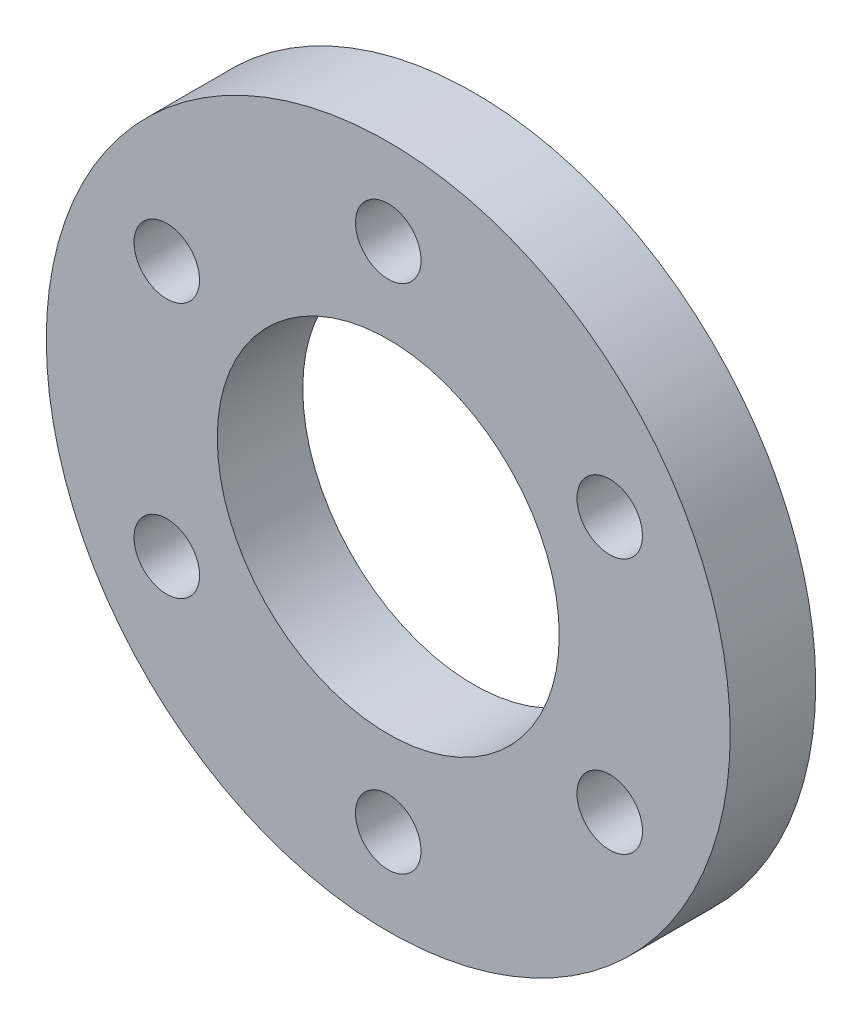
ISO-10303-21;
HEADER;
FILE_DESCRIPTION(('STEP AP214'),'2;1');
FILE_NAME('part.step','',(''),(''),'','','');
FILE_SCHEMA(('AUTOMOTIVE_DESIGN { 1 0 10303 214 1 1 1 1 }'));
ENDSEC;
DATA;
#1=APPLICATION_CONTEXT('core data for automotive mechanical design processes');
#2=APPLICATION_PROTOCOL_DEFINITION('international standard','automotive_design',2000,#1);
#3=PRODUCT_CONTEXT('',#1,'mechanical');
#4=PRODUCT('Part','Part','',(#3));
#5=PRODUCT_RELATED_PRODUCT_CATEGORY('part','',(#4));
#6=PRODUCT_DEFINITION_FORMATION('','',#4);
#7=PRODUCT_DEFINITION_CONTEXT('part definition',#1,'design');
#8=PRODUCT_DEFINITION('design','',#6,#7);
#9=PRODUCT_DEFINITION_SHAPE('','',#8);
#10=(LENGTH_UNIT() NAMED_UNIT(*) SI_UNIT(.MILLI.,.METRE.));
#11=(NAMED_UNIT(*) PLANE_ANGLE_UNIT() SI_UNIT($,.RADIAN.));
#12=(NAMED_UNIT(*) SI_UNIT($,.STERADIAN.) SOLID_ANGLE_UNIT());
#13=UNCERTAINTY_MEASURE_WITH_UNIT(LENGTH_MEASURE(1.E-05),#10,'distance_accuracy_value','');
#14=(GEOMETRIC_REPRESENTATION_CONTEXT(3) GLOBAL_UNCERTAINTY_ASSIGNED_CONTEXT((#13)) GLOBAL_UNIT_ASSIGNED_CONTEXT((#10,
#11,#12)) REPRESENTATION_CONTEXT('',''));
#15=CARTESIAN_POINT('',(0.,0.,0.));
#16=DIRECTION('',(0.,0.,1.));
#17=DIRECTION('',(1.,0.,0.));
#18=AXIS2_PLACEMENT_3D('',#15,#16,#17);
#19=CARTESIAN_POINT('',(0.,0.,10.));
#20=DIRECTION('',(0.,0.,1.));
#21=DIRECTION('',(1.,0.,0.));
#22=AXIS2_PLACEMENT_3D('',#19,#20,#21);
#23=PLANE('',#22);
#24=CARTESIAN_POINT('',(25.9038932989651,14.9556197692173,10.));
#25=DIRECTION('',(0.,0.,1.));
#26=DIRECTION('',(0.50000000000001,-0.866025403784433,0.));
#27=AXIS2_PLACEMENT_3D('',#24,#25,#26);
#28=CIRCLE('',#27,3.83148941120045);
#29=CARTESIAN_POINT('',(27.8196380045654,11.6374526047866,10.));
#30=VERTEX_POINT('',#29);
#31=EDGE_CURVE('E76',#30,#30,#28,.T.);
#32=ORIENTED_EDGE('',*,*,#31,.F.);
#33=EDGE_LOOP('',(#32));
#34=FACE_BOUND('',#33,.T.);
#35=CARTESIAN_POINT('',(25.9038932989655,-14.9556197692167,10.));
#36=DIRECTION('',(0.,0.,1.));
#37=DIRECTION('',(-0.499999999999992,-0.866025403784443,0.));
#38=AXIS2_PLACEMENT_3D('',#35,#36,#37);
#39=CIRCLE('',#38,3.83148941120045);
#40=CARTESIAN_POINT('',(23.9881485933653,-18.2737869336474,10.));
#41=VERTEX_POINT('',#40);
#42=EDGE_CURVE('E84',#41,#41,#39,.T.);
#43=ORIENTED_EDGE('',*,*,#42,.F.);
#44=EDGE_LOOP('',(#43));
#45=FACE_BOUND('',#44,.T.);
#46=CARTESIAN_POINT('',(0.,-29.9112395384339,10.));
#47=DIRECTION('',(0.,0.,1.));
#48=DIRECTION('',(-1.,0.,0.));
#49=AXIS2_PLACEMENT_3D('',#46,#47,#48);
#50=CIRCLE('',#49,3.83148941120045);
#51=CARTESIAN_POINT('',(-3.83148941120045,-29.9112395384339,10.));
#52=VERTEX_POINT('',#51);
#53=EDGE_CURVE('E92',#52,#52,#50,.T.);
#54=ORIENTED_EDGE('',*,*,#53,.F.);
#55=EDGE_LOOP('',(#54));
#56=FACE_BOUND('',#55,.T.);
#57=CARTESIAN_POINT('',(-25.9038932989653,-14.9556197692171,10.));
#58=DIRECTION('',(0.,0.,1.));
#59=DIRECTION('',(-0.500000000000004,0.866025403784436,0.));
#60=AXIS2_PLACEMENT_3D('',#57,#58,#59);
#61=CIRCLE('',#60,3.83148941120045);
#62=CARTESIAN_POINT('',(-27.8196380045655,-11.6374526047864,10.));
#63=VERTEX_POINT('',#62);
#64=EDGE_CURVE('E100',#63,#63,#61,.T.);
#65=ORIENTED_EDGE('',*,*,#64,.F.);
#66=EDGE_LOOP('',(#65));
#67=FACE_BOUND('',#66,.T.);
#68=CARTESIAN_POINT('',(-25.9038932989654,14.9556197692169,10.));
#69=DIRECTION('',(0.,0.,1.));
#70=DIRECTION('',(0.499999999999998,0.86602540378444,0.));
#71=AXIS2_PLACEMENT_3D('',#68,#69,#70);
#72=CIRCLE('',#71,3.83148941120045);
#73=CARTESIAN_POINT('',(-23.9881485933651,18.2737869336476,10.));
#74=VERTEX_POINT('',#73);
#75=EDGE_CURVE('E68',#74,#74,#72,.T.);
#76=ORIENTED_EDGE('',*,*,#75,.F.);
#77=EDGE_LOOP('',(#76));
#78=FACE_BOUND('',#77,.T.);
#79=CARTESIAN_POINT('',(0.,29.9112395384339,10.));
#80=DIRECTION('',(0.,0.,1.));
#81=DIRECTION('',(1.,0.,0.));
#82=AXIS2_PLACEMENT_3D('',#79,#80,#81);
#83=CIRCLE('',#82,3.83148941120045);
#84=CARTESIAN_POINT('',(3.83148941120045,29.9112395384339,10.));
#85=VERTEX_POINT('',#84);
#86=EDGE_CURVE('E60',#85,#85,#83,.T.);
#87=ORIENTED_EDGE('',*,*,#86,.F.);
#88=EDGE_LOOP('',(#87));
#89=FACE_BOUND('',#88,.T.);
#90=CARTESIAN_POINT('',(0.,0.,10.));
#91=DIRECTION('',(0.,0.,1.));
#92=DIRECTION('',(1.,0.,0.));
#93=AXIS2_PLACEMENT_3D('',#90,#91,#92);
#94=CIRCLE('',#93,40.);
#95=CARTESIAN_POINT('',(40.,0.,10.));
#96=VERTEX_POINT('',#95);
#97=EDGE_CURVE('E10',#96,#96,#94,.T.);
#98=ORIENTED_EDGE('',*,*,#97,.T.);
#99=EDGE_LOOP('',(#98));
#100=FACE_BOUND('',#99,.T.);
#101=CARTESIAN_POINT('',(0.,0.,10.));
#102=DIRECTION('',(0.,0.,1.));
#103=DIRECTION('',(1.,0.,0.));
#104=AXIS2_PLACEMENT_3D('',#101,#102,#103);
#105=CIRCLE('',#104,20.);
#106=CARTESIAN_POINT('',(20.,0.,10.));
#107=VERTEX_POINT('',#106);
#108=EDGE_CURVE('E50',#107,#107,#105,.T.);
#109=ORIENTED_EDGE('',*,*,#108,.F.);
#110=EDGE_LOOP('',(#109));
#111=FACE_BOUND('',#110,.T.);
#112=ADVANCED_FACE('F37',(#34,#45,#56,#67,#78,#89,#100,#111),#23,.T.);
#113=CARTESIAN_POINT('',(0.,0.,0.));
#114=DIRECTION('',(0.,0.,1.));
#115=DIRECTION('',(1.,0.,0.));
#116=AXIS2_PLACEMENT_3D('',#113,#114,#115);
#117=PLANE('',#116);
#118=CARTESIAN_POINT('',(25.9038932989651,14.9556197692173,0.));
#119=DIRECTION('',(0.,0.,1.));
#120=DIRECTION('',(0.50000000000001,-0.866025403784433,0.));
#121=AXIS2_PLACEMENT_3D('',#118,#119,#120);
#122=CIRCLE('',#121,3.83148941120045);
#123=CARTESIAN_POINT('',(27.8196380045654,11.6374526047866,0.));
#124=VERTEX_POINT('',#123);
#125=EDGE_CURVE('E80',#124,#124,#122,.T.);
#126=ORIENTED_EDGE('',*,*,#125,.T.);
#127=EDGE_LOOP('',(#126));
#128=FACE_BOUND('',#127,.T.);
#129=CARTESIAN_POINT('',(25.9038932989655,-14.9556197692167,0.));
#130=DIRECTION('',(0.,0.,1.));
#131=DIRECTION('',(-0.499999999999992,-0.866025403784443,0.));
#132=AXIS2_PLACEMENT_3D('',#129,#130,#131);
#133=CIRCLE('',#132,3.83148941120045);
#134=CARTESIAN_POINT('',(23.9881485933653,-18.2737869336474,0.));
#135=VERTEX_POINT('',#134);
#136=EDGE_CURVE('E88',#135,#135,#133,.T.);
#137=ORIENTED_EDGE('',*,*,#136,.T.);
#138=EDGE_LOOP('',(#137));
#139=FACE_BOUND('',#138,.T.);
#140=CARTESIAN_POINT('',(0.,-29.9112395384339,0.));
#141=DIRECTION('',(0.,0.,1.));
#142=DIRECTION('',(-1.,0.,0.));
#143=AXIS2_PLACEMENT_3D('',#140,#141,#142);
#144=CIRCLE('',#143,3.83148941120045);
#145=CARTESIAN_POINT('',(-3.83148941120045,-29.9112395384339,0.));
#146=VERTEX_POINT('',#145);
#147=EDGE_CURVE('E96',#146,#146,#144,.T.);
#148=ORIENTED_EDGE('',*,*,#147,.T.);
#149=EDGE_LOOP('',(#148));
#150=FACE_BOUND('',#149,.T.);
#151=CARTESIAN_POINT('',(-25.9038932989653,-14.9556197692171,0.));
#152=DIRECTION('',(0.,0.,1.));
#153=DIRECTION('',(-0.500000000000004,0.866025403784436,0.));
#154=AXIS2_PLACEMENT_3D('',#151,#152,#153);
#155=CIRCLE('',#154,3.83148941120045);
#156=CARTESIAN_POINT('',(-27.8196380045655,-11.6374526047864,0.));
#157=VERTEX_POINT('',#156);
#158=EDGE_CURVE('E72',#157,#157,#155,.T.);
#159=ORIENTED_EDGE('',*,*,#158,.T.);
#160=EDGE_LOOP('',(#159));
#161=FACE_BOUND('',#160,.T.);
#162=CARTESIAN_POINT('',(-25.9038932989654,14.9556197692169,0.));
#163=DIRECTION('',(0.,0.,1.));
#164=DIRECTION('',(0.499999999999998,0.86602540378444,0.));
#165=AXIS2_PLACEMENT_3D('',#162,#163,#164);
#166=CIRCLE('',#165,3.83148941120045);
#167=CARTESIAN_POINT('',(-23.9881485933651,18.2737869336476,0.));
#168=VERTEX_POINT('',#167);
#169=EDGE_CURVE('E64',#168,#168,#166,.T.);
#170=ORIENTED_EDGE('',*,*,#169,.T.);
#171=EDGE_LOOP('',(#170));
#172=FACE_BOUND('',#171,.T.);
#173=CARTESIAN_POINT('',(0.,29.9112395384339,0.));
#174=DIRECTION('',(0.,0.,1.));
#175=DIRECTION('',(1.,0.,0.));
#176=AXIS2_PLACEMENT_3D('',#173,#174,#175);
#177=CIRCLE('',#176,3.83148941120045);
#178=CARTESIAN_POINT('',(3.83148941120045,29.9112395384339,0.));
#179=VERTEX_POINT('',#178);
#180=EDGE_CURVE('E56',#179,#179,#177,.T.);
#181=ORIENTED_EDGE('',*,*,#180,.T.);
#182=EDGE_LOOP('',(#181));
#183=FACE_BOUND('',#182,.T.);
#184=CARTESIAN_POINT('',(0.,0.,0.));
#185=DIRECTION('',(0.,0.,1.));
#186=DIRECTION('',(1.,0.,0.));
#187=AXIS2_PLACEMENT_3D('',#184,#185,#186);
#188=CIRCLE('',#187,40.);
#189=CARTESIAN_POINT('',(40.,0.,0.));
#190=VERTEX_POINT('',#189);
#191=EDGE_CURVE('E41',#190,#190,#188,.T.);
#192=ORIENTED_EDGE('',*,*,#191,.F.);
#193=EDGE_LOOP('',(#192));
#194=FACE_BOUND('',#193,.T.);
#195=CARTESIAN_POINT('',(0.,0.,0.));
#196=DIRECTION('',(0.,0.,1.));
#197=DIRECTION('',(1.,0.,0.));
#198=AXIS2_PLACEMENT_3D('',#195,#196,#197);
#199=CIRCLE('',#198,20.);
#200=CARTESIAN_POINT('',(20.,0.,0.));
#201=VERTEX_POINT('',#200);
#202=EDGE_CURVE('E52',#201,#201,#199,.T.);
#203=ORIENTED_EDGE('',*,*,#202,.T.);
#204=EDGE_LOOP('',(#203));
#205=FACE_BOUND('',#204,.T.);
#206=ADVANCED_FACE('F108',(#128,#139,#150,#161,#172,#183,#194,#205),#117,.F.);
#207=CARTESIAN_POINT('',(0.,0.,10.));
#208=DIRECTION('',(0.,0.,-1.));
#209=DIRECTION('',(-1.,0.,0.));
#210=AXIS2_PLACEMENT_3D('',#207,#208,#209);
#211=CYLINDRICAL_SURFACE('',#210,40.);
#212=ORIENTED_EDGE('',*,*,#97,.F.);
#213=EDGE_LOOP('',(#212));
#214=FACE_BOUND('',#213,.T.);
#215=ORIENTED_EDGE('',*,*,#191,.T.);
#216=EDGE_LOOP('',(#215));
#217=FACE_BOUND('',#216,.T.);
#218=ADVANCED_FACE('F39',(#214,#217),#211,.T.);
#219=CARTESIAN_POINT('',(0.,0.,10.));
#220=DIRECTION('',(0.,0.,-1.));
#221=DIRECTION('',(-1.,0.,0.));
#222=AXIS2_PLACEMENT_3D('',#219,#220,#221);
#223=CYLINDRICAL_SURFACE('',#222,20.);
#224=ORIENTED_EDGE('',*,*,#108,.T.);
#225=EDGE_LOOP('',(#224));
#226=FACE_BOUND('',#225,.T.);
#227=ORIENTED_EDGE('',*,*,#202,.F.);
#228=EDGE_LOOP('',(#227));
#229=FACE_BOUND('',#228,.T.);
#230=ADVANCED_FACE('F129',(#226,#229),#223,.F.);
#231=CARTESIAN_POINT('',(0.,29.9112395384339,0.));
#232=DIRECTION('',(0.,0.,1.));
#233=DIRECTION('',(1.,0.,0.));
#234=AXIS2_PLACEMENT_3D('',#231,#232,#233);
#235=CYLINDRICAL_SURFACE('',#234,3.83148941120045);
#236=ORIENTED_EDGE('',*,*,#180,.F.);
#237=EDGE_LOOP('',(#236));
#238=FACE_BOUND('',#237,.T.);
#239=ORIENTED_EDGE('',*,*,#86,.T.);
#240=EDGE_LOOP('',(#239));
#241=FACE_BOUND('',#240,.T.);
#242=ADVANCED_FACE('F132',(#238,#241),#235,.F.);
#243=CARTESIAN_POINT('',(-25.9038932989654,14.9556197692169,0.));
#244=DIRECTION('',(0.,0.,1.));
#245=DIRECTION('',(1.,0.,0.));
#246=AXIS2_PLACEMENT_3D('',#243,#244,#245);
#247=CYLINDRICAL_SURFACE('',#246,3.83148941120045);
#248=ORIENTED_EDGE('',*,*,#169,.F.);
#249=EDGE_LOOP('',(#248));
#250=FACE_BOUND('',#249,.T.);
#251=ORIENTED_EDGE('',*,*,#75,.T.);
#252=EDGE_LOOP('',(#251));
#253=FACE_BOUND('',#252,.T.);
#254=ADVANCED_FACE('F115',(#250,#253),#247,.F.);
#255=CARTESIAN_POINT('',(-25.9038932989653,-14.9556197692171,0.));
#256=DIRECTION('',(0.,0.,1.));
#257=DIRECTION('',(1.,0.,0.));
#258=AXIS2_PLACEMENT_3D('',#255,#256,#257);
#259=CYLINDRICAL_SURFACE('',#258,3.83148941120045);
#260=ORIENTED_EDGE('',*,*,#158,.F.);
#261=EDGE_LOOP('',(#260));
#262=FACE_BOUND('',#261,.T.);
#263=ORIENTED_EDGE('',*,*,#64,.T.);
#264=EDGE_LOOP('',(#263));
#265=FACE_BOUND('',#264,.T.);
#266=ADVANCED_FACE('F111',(#262,#265),#259,.F.);
#267=CARTESIAN_POINT('',(0.,-29.9112395384339,0.));
#268=DIRECTION('',(0.,0.,1.));
#269=DIRECTION('',(1.,0.,0.));
#270=AXIS2_PLACEMENT_3D('',#267,#268,#269);
#271=CYLINDRICAL_SURFACE('',#270,3.83148941120045);
#272=ORIENTED_EDGE('',*,*,#147,.F.);
#273=EDGE_LOOP('',(#272));
#274=FACE_BOUND('',#273,.T.);
#275=ORIENTED_EDGE('',*,*,#53,.T.);
#276=EDGE_LOOP('',(#275));
#277=FACE_BOUND('',#276,.T.);
#278=ADVANCED_FACE('F114',(#274,#277),#271,.F.);
#279=CARTESIAN_POINT('',(25.9038932989655,-14.9556197692167,0.));
#280=DIRECTION('',(0.,0.,1.));
#281=DIRECTION('',(1.,0.,0.));
#282=AXIS2_PLACEMENT_3D('',#279,#280,#281);
#283=CYLINDRICAL_SURFACE('',#282,3.83148941120045);
#284=ORIENTED_EDGE('',*,*,#136,.F.);
#285=EDGE_LOOP('',(#284));
#286=FACE_BOUND('',#285,.T.);
#287=ORIENTED_EDGE('',*,*,#42,.T.);
#288=EDGE_LOOP('',(#287));
#289=FACE_BOUND('',#288,.T.);
#290=ADVANCED_FACE('F153',(#286,#289),#283,.F.);
#291=CARTESIAN_POINT('',(25.9038932989651,14.9556197692173,0.));
#292=DIRECTION('',(0.,0.,1.));
#293=DIRECTION('',(1.,0.,0.));
#294=AXIS2_PLACEMENT_3D('',#291,#292,#293);
#295=CYLINDRICAL_SURFACE('',#294,3.83148941120045);
#296=ORIENTED_EDGE('',*,*,#125,.F.);
#297=EDGE_LOOP('',(#296));
#298=FACE_BOUND('',#297,.T.);
#299=ORIENTED_EDGE('',*,*,#31,.T.);
#300=EDGE_LOOP('',(#299));
#301=FACE_BOUND('',#300,.T.);
#302=ADVANCED_FACE('F150',(#298,#301),#295,.F.);
#303=CLOSED_SHELL('',(#112,#206,#218,#230,#242,#254,#266,#278,#290,#302));
#304=MANIFOLD_SOLID_BREP('B2',#303);
#305=ADVANCED_BREP_SHAPE_REPRESENTATION('',(#18,#304),#14);
#306=SHAPE_DEFINITION_REPRESENTATION(#9,#305);
ENDSEC;
END-ISO-10303-21;
